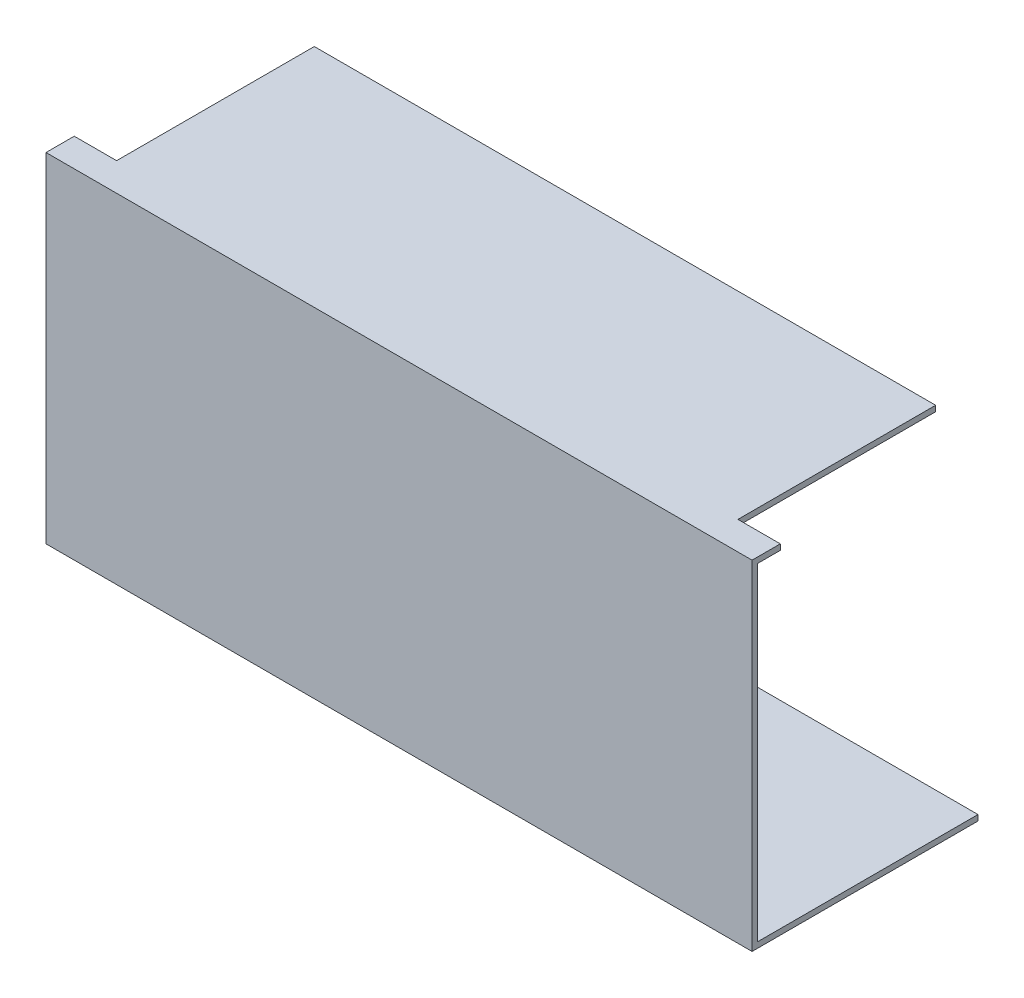
ISO-10303-21;
HEADER;
FILE_DESCRIPTION(('STEP AP214'),'2;1');
FILE_NAME('part.step','',(''),(''),'','','');
FILE_SCHEMA(('AUTOMOTIVE_DESIGN { 1 0 10303 214 1 1 1 1 }'));
ENDSEC;
DATA;
#1=APPLICATION_CONTEXT('core data for automotive mechanical design processes');
#2=APPLICATION_PROTOCOL_DEFINITION('international standard','automotive_design',2000,#1);
#3=PRODUCT_CONTEXT('',#1,'mechanical');
#4=PRODUCT('Part','Part','',(#3));
#5=PRODUCT_RELATED_PRODUCT_CATEGORY('part','',(#4));
#6=PRODUCT_DEFINITION_FORMATION('','',#4);
#7=PRODUCT_DEFINITION_CONTEXT('part definition',#1,'design');
#8=PRODUCT_DEFINITION('design','',#6,#7);
#9=PRODUCT_DEFINITION_SHAPE('','',#8);
#10=(LENGTH_UNIT() NAMED_UNIT(*) SI_UNIT(.MILLI.,.METRE.));
#11=(NAMED_UNIT(*) PLANE_ANGLE_UNIT() SI_UNIT($,.RADIAN.));
#12=(NAMED_UNIT(*) SI_UNIT($,.STERADIAN.) SOLID_ANGLE_UNIT());
#13=UNCERTAINTY_MEASURE_WITH_UNIT(LENGTH_MEASURE(1.E-05),#10,'distance_accuracy_value','');
#14=(GEOMETRIC_REPRESENTATION_CONTEXT(3) GLOBAL_UNCERTAINTY_ASSIGNED_CONTEXT((#13)) GLOBAL_UNIT_ASSIGNED_CONTEXT((#10,
#11,#12)) REPRESENTATION_CONTEXT('',''));
#15=CARTESIAN_POINT('',(0.,0.,0.));
#16=DIRECTION('',(0.,0.,1.));
#17=DIRECTION('',(1.,0.,0.));
#18=AXIS2_PLACEMENT_3D('',#15,#16,#17);
#19=CARTESIAN_POINT('',(0.625,-0.3,1.));
#20=DIRECTION('',(0.,1.,0.));
#21=DIRECTION('',(0.,0.,1.));
#22=AXIS2_PLACEMENT_3D('',#19,#20,#21);
#23=PLANE('',#22);
#24=DIRECTION('',(0.,0.,-1.));
#25=VECTOR('',#24,1.);
#26=CARTESIAN_POINT('',(-0.625,-0.3,0.799999999813736));
#27=LINE('',#26,#25);
#28=CARTESIAN_POINT('',(-0.625,-0.299999999627471,1.));
#29=VERTEX_POINT('',#28);
#30=CARTESIAN_POINT('',(-0.625,-0.3,0.599999999627471));
#31=VERTEX_POINT('',#30);
#32=EDGE_CURVE('E11',#29,#31,#27,.T.);
#33=ORIENTED_EDGE('',*,*,#32,.T.);
#34=DIRECTION('',(-1.,0.,0.));
#35=VECTOR('',#34,1.);
#36=CARTESIAN_POINT('',(0.,-0.3,0.599999999627471));
#37=LINE('',#36,#35);
#38=CARTESIAN_POINT('',(0.625,-0.3,0.599999999627471));
#39=VERTEX_POINT('',#38);
#40=EDGE_CURVE('E24',#39,#31,#37,.T.);
#41=ORIENTED_EDGE('',*,*,#40,.F.);
#42=DIRECTION('',(0.,0.,-1.));
#43=VECTOR('',#42,1.);
#44=CARTESIAN_POINT('',(0.625,-0.3,0.799999999813736));
#45=LINE('',#44,#43);
#46=CARTESIAN_POINT('',(0.625,-0.299999999627471,1.));
#47=VERTEX_POINT('',#46);
#48=EDGE_CURVE('E199',#47,#39,#45,.T.);
#49=ORIENTED_EDGE('',*,*,#48,.F.);
#50=DIRECTION('',(-1.,0.,0.));
#51=VECTOR('',#50,1.);
#52=CARTESIAN_POINT('',(0.,-0.299999999627471,1.));
#53=LINE('',#52,#51);
#54=EDGE_CURVE('E197',#47,#29,#53,.T.);
#55=ORIENTED_EDGE('',*,*,#54,.T.);
#56=EDGE_LOOP('',(#33,#41,#49,#55));
#57=FACE_BOUND('',#56,.T.);
#58=ADVANCED_FACE('F17',(#57),#23,.F.);
#59=CARTESIAN_POINT('',(0.625,-0.29,0.6));
#60=DIRECTION('',(0.,0.,1.));
#61=DIRECTION('',(1.,0.,0.));
#62=AXIS2_PLACEMENT_3D('',#59,#60,#61);
#63=PLANE('',#62);
#64=DIRECTION('',(0.,1.,0.));
#65=VECTOR('',#64,1.);
#66=CARTESIAN_POINT('',(-0.625,-0.294999999888241,0.6));
#67=LINE('',#66,#65);
#68=CARTESIAN_POINT('',(-0.625,-0.29,0.6));
#69=VERTEX_POINT('',#68);
#70=EDGE_CURVE('E195',#31,#69,#67,.T.);
#71=ORIENTED_EDGE('',*,*,#70,.T.);
#72=DIRECTION('',(-1.,0.,0.));
#73=VECTOR('',#72,1.);
#74=CARTESIAN_POINT('',(0.,-0.29,0.6));
#75=LINE('',#74,#73);
#76=CARTESIAN_POINT('',(0.625,-0.29,0.6));
#77=VERTEX_POINT('',#76);
#78=EDGE_CURVE('E192',#77,#69,#75,.T.);
#79=ORIENTED_EDGE('',*,*,#78,.F.);
#80=DIRECTION('',(0.,1.,0.));
#81=VECTOR('',#80,1.);
#82=CARTESIAN_POINT('',(0.625,-0.294999999888241,0.6));
#83=LINE('',#82,#81);
#84=EDGE_CURVE('E189',#39,#77,#83,.T.);
#85=ORIENTED_EDGE('',*,*,#84,.F.);
#86=ORIENTED_EDGE('',*,*,#40,.T.);
#87=EDGE_LOOP('',(#71,#79,#85,#86));
#88=FACE_BOUND('',#87,.T.);
#89=ADVANCED_FACE('F203',(#88),#63,.F.);
#90=CARTESIAN_POINT('',(0.625,-0.29,0.99));
#91=DIRECTION('',(0.,-1.,0.));
#92=DIRECTION('',(0.,0.,-1.));
#93=AXIS2_PLACEMENT_3D('',#90,#91,#92);
#94=PLANE('',#93);
#95=DIRECTION('',(0.,0.,1.));
#96=VECTOR('',#95,1.);
#97=CARTESIAN_POINT('',(-0.625,-0.29,0.794999999701977));
#98=LINE('',#97,#96);
#99=CARTESIAN_POINT('',(-0.625,-0.29,0.99));
#100=VERTEX_POINT('',#99);
#101=EDGE_CURVE('E187',#69,#100,#98,.T.);
#102=ORIENTED_EDGE('',*,*,#101,.T.);
#103=DIRECTION('',(-1.,0.,0.));
#104=VECTOR('',#103,1.);
#105=CARTESIAN_POINT('',(0.,-0.29,0.99));
#106=LINE('',#105,#104);
#107=CARTESIAN_POINT('',(0.625,-0.29,0.99));
#108=VERTEX_POINT('',#107);
#109=EDGE_CURVE('E184',#108,#100,#106,.T.);
#110=ORIENTED_EDGE('',*,*,#109,.F.);
#111=DIRECTION('',(0.,0.,1.));
#112=VECTOR('',#111,1.);
#113=CARTESIAN_POINT('',(0.625,-0.29,0.794999999701977));
#114=LINE('',#113,#112);
#115=EDGE_CURVE('E181',#77,#108,#114,.T.);
#116=ORIENTED_EDGE('',*,*,#115,.F.);
#117=ORIENTED_EDGE('',*,*,#78,.T.);
#118=EDGE_LOOP('',(#102,#110,#116,#117));
#119=FACE_BOUND('',#118,.T.);
#120=ADVANCED_FACE('F209',(#119),#94,.F.);
#121=CARTESIAN_POINT('',(0.625,0.29,0.99));
#122=DIRECTION('',(0.,0.,1.));
#123=DIRECTION('',(1.,0.,0.));
#124=AXIS2_PLACEMENT_3D('',#121,#122,#123);
#125=PLANE('',#124);
#126=DIRECTION('',(0.,1.,0.));
#127=VECTOR('',#126,1.);
#128=CARTESIAN_POINT('',(-0.625,-3.72531450132385E-11,0.99));
#129=LINE('',#128,#127);
#130=CARTESIAN_POINT('',(-0.625,0.29,0.99));
#131=VERTEX_POINT('',#130);
#132=EDGE_CURVE('E179',#100,#131,#129,.T.);
#133=ORIENTED_EDGE('',*,*,#132,.T.);
#134=DIRECTION('',(-1.,0.,0.));
#135=VECTOR('',#134,1.);
#136=CARTESIAN_POINT('',(0.,0.29,0.99));
#137=LINE('',#136,#135);
#138=CARTESIAN_POINT('',(0.625,0.29,0.99));
#139=VERTEX_POINT('',#138);
#140=EDGE_CURVE('E176',#139,#131,#137,.T.);
#141=ORIENTED_EDGE('',*,*,#140,.F.);
#142=DIRECTION('',(0.,1.,0.));
#143=VECTOR('',#142,1.);
#144=CARTESIAN_POINT('',(0.625,-3.72531450132385E-11,0.99));
#145=LINE('',#144,#143);
#146=EDGE_CURVE('E173',#108,#139,#145,.T.);
#147=ORIENTED_EDGE('',*,*,#146,.F.);
#148=ORIENTED_EDGE('',*,*,#109,.T.);
#149=EDGE_LOOP('',(#133,#141,#147,#148));
#150=FACE_BOUND('',#149,.T.);
#151=ADVANCED_FACE('F213',(#150),#125,.F.);
#152=CARTESIAN_POINT('',(0.625,0.29,0.6));
#153=DIRECTION('',(0.,1.,0.));
#154=DIRECTION('',(0.,0.,1.));
#155=AXIS2_PLACEMENT_3D('',#152,#153,#154);
#156=PLANE('',#155);
#157=DIRECTION('',(-1.,0.,0.));
#158=VECTOR('',#157,1.);
#159=CARTESIAN_POINT('',(0.,0.29,0.6));
#160=LINE('',#159,#158);
#161=CARTESIAN_POINT('',(0.550000000745058,0.29,0.6));
#162=VERTEX_POINT('',#161);
#163=CARTESIAN_POINT('',(-0.550000000745058,0.29,0.6));
#164=VERTEX_POINT('',#163);
#165=EDGE_CURVE('E171',#162,#164,#160,.T.);
#166=ORIENTED_EDGE('',*,*,#165,.F.);
#167=DIRECTION('',(0.,0.,1.));
#168=VECTOR('',#167,1.);
#169=CARTESIAN_POINT('',(0.550000000745058,0.29,0.774999999813736));
#170=LINE('',#169,#168);
#171=CARTESIAN_POINT('',(0.550000000745058,0.29,0.949999999627471));
#172=VERTEX_POINT('',#171);
#173=EDGE_CURVE('E169',#162,#172,#170,.T.);
#174=ORIENTED_EDGE('',*,*,#173,.T.);
#175=DIRECTION('',(1.,0.,0.));
#176=VECTOR('',#175,1.);
#177=CARTESIAN_POINT('',(0.587500000372529,0.29,0.949999999627471));
#178=LINE('',#177,#176);
#179=CARTESIAN_POINT('',(0.625,0.29,0.949999999627471));
#180=VERTEX_POINT('',#179);
#181=EDGE_CURVE('E119',#172,#180,#178,.T.);
#182=ORIENTED_EDGE('',*,*,#181,.T.);
#183=DIRECTION('',(0.,0.,-1.));
#184=VECTOR('',#183,1.);
#185=CARTESIAN_POINT('',(0.625,0.29,0.970000000111759));
#186=LINE('',#185,#184);
#187=EDGE_CURVE('E165',#139,#180,#186,.T.);
#188=ORIENTED_EDGE('',*,*,#187,.F.);
#189=ORIENTED_EDGE('',*,*,#140,.T.);
#190=DIRECTION('',(0.,0.,-1.));
#191=VECTOR('',#190,1.);
#192=CARTESIAN_POINT('',(-0.625,0.29,0.970000000111759));
#193=LINE('',#192,#191);
#194=CARTESIAN_POINT('',(-0.625,0.29,0.949999999627471));
#195=VERTEX_POINT('',#194);
#196=EDGE_CURVE('E163',#131,#195,#193,.T.);
#197=ORIENTED_EDGE('',*,*,#196,.T.);
#198=DIRECTION('',(1.,0.,0.));
#199=VECTOR('',#198,1.);
#200=CARTESIAN_POINT('',(-0.587500000372529,0.29,0.949999999627471));
#201=LINE('',#200,#199);
#202=CARTESIAN_POINT('',(-0.550000000745058,0.29,0.949999999627471));
#203=VERTEX_POINT('',#202);
#204=EDGE_CURVE('E161',#195,#203,#201,.T.);
#205=ORIENTED_EDGE('',*,*,#204,.T.);
#206=DIRECTION('',(0.,0.,-1.));
#207=VECTOR('',#206,1.);
#208=CARTESIAN_POINT('',(-0.550000000745058,0.29,0.774999999813736));
#209=LINE('',#208,#207);
#210=EDGE_CURVE('E158',#203,#164,#209,.T.);
#211=ORIENTED_EDGE('',*,*,#210,.T.);
#212=EDGE_LOOP('',(#166,#174,#182,#188,#189,#197,#205,#211));
#213=FACE_BOUND('',#212,.T.);
#214=ADVANCED_FACE('F218',(#213),#156,.F.);
#215=CARTESIAN_POINT('',(0.625,0.3,1.));
#216=DIRECTION('',(1.,0.,0.));
#217=DIRECTION('',(0.,0.,-1.));
#218=AXIS2_PLACEMENT_3D('',#215,#216,#217);
#219=PLANE('',#218);
#220=DIRECTION('',(0.,1.,0.));
#221=VECTOR('',#220,1.);
#222=CARTESIAN_POINT('',(0.625,0.295000000111758,0.949999999254942));
#223=LINE('',#222,#221);
#224=CARTESIAN_POINT('',(0.625,0.3,0.949999999627471));
#225=VERTEX_POINT('',#224);
#226=EDGE_CURVE('E156',#180,#225,#223,.T.);
#227=ORIENTED_EDGE('',*,*,#226,.T.);
#228=DIRECTION('',(0.,0.,1.));
#229=VECTOR('',#228,1.);
#230=CARTESIAN_POINT('',(0.625,0.3,0.975));
#231=LINE('',#230,#229);
#232=CARTESIAN_POINT('',(0.625,0.3,1.00000000037253));
#233=VERTEX_POINT('',#232);
#234=EDGE_CURVE('E124',#225,#233,#231,.T.);
#235=ORIENTED_EDGE('',*,*,#234,.T.);
#236=DIRECTION('',(0.,-1.,0.));
#237=VECTOR('',#236,1.);
#238=CARTESIAN_POINT('',(0.625,1.86264448309714E-10,1.));
#239=LINE('',#238,#237);
#240=EDGE_CURVE('E152',#233,#47,#239,.T.);
#241=ORIENTED_EDGE('',*,*,#240,.T.);
#242=ORIENTED_EDGE('',*,*,#48,.T.);
#243=ORIENTED_EDGE('',*,*,#84,.T.);
#244=ORIENTED_EDGE('',*,*,#115,.T.);
#245=ORIENTED_EDGE('',*,*,#146,.T.);
#246=ORIENTED_EDGE('',*,*,#187,.T.);
#247=EDGE_LOOP('',(#227,#235,#241,#242,#243,#244,#245,#246));
#248=FACE_BOUND('',#247,.T.);
#249=ADVANCED_FACE('F216',(#248),#219,.T.);
#250=CARTESIAN_POINT('',(0.625,0.3,1.));
#251=DIRECTION('',(0.,0.,-1.));
#252=DIRECTION('',(-1.,0.,0.));
#253=AXIS2_PLACEMENT_3D('',#250,#251,#252);
#254=PLANE('',#253);
#255=DIRECTION('',(0.,-1.,0.));
#256=VECTOR('',#255,1.);
#257=CARTESIAN_POINT('',(-0.625,1.86264448309714E-10,1.));
#258=LINE('',#257,#256);
#259=CARTESIAN_POINT('',(-0.625,0.3,1.00000000037253));
#260=VERTEX_POINT('',#259);
#261=EDGE_CURVE('E149',#260,#29,#258,.T.);
#262=ORIENTED_EDGE('',*,*,#261,.T.);
#263=ORIENTED_EDGE('',*,*,#54,.F.);
#264=ORIENTED_EDGE('',*,*,#240,.F.);
#265=DIRECTION('',(-1.,0.,0.));
#266=VECTOR('',#265,1.);
#267=CARTESIAN_POINT('',(0.,0.3,1.00000000037253));
#268=LINE('',#267,#266);
#269=EDGE_CURVE('E146',#233,#260,#268,.T.);
#270=ORIENTED_EDGE('',*,*,#269,.T.);
#271=EDGE_LOOP('',(#262,#263,#264,#270));
#272=FACE_BOUND('',#271,.T.);
#273=ADVANCED_FACE('F234',(#272),#254,.F.);
#274=CARTESIAN_POINT('',(-0.625,0.3,1.));
#275=DIRECTION('',(1.,0.,0.));
#276=DIRECTION('',(0.,0.,-1.));
#277=AXIS2_PLACEMENT_3D('',#274,#275,#276);
#278=PLANE('',#277);
#279=DIRECTION('',(0.,0.,1.));
#280=VECTOR('',#279,1.);
#281=CARTESIAN_POINT('',(-0.625,0.3,0.975));
#282=LINE('',#281,#280);
#283=CARTESIAN_POINT('',(-0.625,0.3,0.949999999627471));
#284=VERTEX_POINT('',#283);
#285=EDGE_CURVE('E143',#284,#260,#282,.T.);
#286=ORIENTED_EDGE('',*,*,#285,.F.);
#287=DIRECTION('',(0.,1.,0.));
#288=VECTOR('',#287,1.);
#289=CARTESIAN_POINT('',(-0.625,0.295000000111758,0.949999999254942));
#290=LINE('',#289,#288);
#291=EDGE_CURVE('E140',#195,#284,#290,.T.);
#292=ORIENTED_EDGE('',*,*,#291,.F.);
#293=ORIENTED_EDGE('',*,*,#196,.F.);
#294=ORIENTED_EDGE('',*,*,#132,.F.);
#295=ORIENTED_EDGE('',*,*,#101,.F.);
#296=ORIENTED_EDGE('',*,*,#70,.F.);
#297=ORIENTED_EDGE('',*,*,#32,.F.);
#298=ORIENTED_EDGE('',*,*,#261,.F.);
#299=EDGE_LOOP('',(#286,#292,#293,#294,#295,#296,#297,#298));
#300=FACE_BOUND('',#299,.T.);
#301=ADVANCED_FACE('F205',(#300),#278,.F.);
#302=CARTESIAN_POINT('',(-0.625,-0.0679455265819091,0.95));
#303=DIRECTION('',(0.,0.,1.));
#304=DIRECTION('',(0.,-1.,0.));
#305=AXIS2_PLACEMENT_3D('',#302,#303,#304);
#306=PLANE('',#305);
#307=ORIENTED_EDGE('',*,*,#291,.T.);
#308=DIRECTION('',(1.,0.,0.));
#309=VECTOR('',#308,1.);
#310=CARTESIAN_POINT('',(-0.587500000372529,0.3,0.949999999627471));
#311=LINE('',#310,#309);
#312=CARTESIAN_POINT('',(-0.550000000745058,0.3,0.949999999627471));
#313=VERTEX_POINT('',#312);
#314=EDGE_CURVE('E138',#284,#313,#311,.T.);
#315=ORIENTED_EDGE('',*,*,#314,.T.);
#316=DIRECTION('',(0.,1.,0.));
#317=VECTOR('',#316,1.);
#318=CARTESIAN_POINT('',(-0.550000000745058,0.294999999325071,0.95));
#319=LINE('',#318,#317);
#320=EDGE_CURVE('E135',#203,#313,#319,.T.);
#321=ORIENTED_EDGE('',*,*,#320,.F.);
#322=ORIENTED_EDGE('',*,*,#204,.F.);
#323=EDGE_LOOP('',(#307,#315,#321,#322));
#324=FACE_BOUND('',#323,.T.);
#325=ADVANCED_FACE('F230',(#324),#306,.F.);
#326=CARTESIAN_POINT('',(-0.55,-0.0679455265819091,0.95));
#327=DIRECTION('',(1.,0.,0.));
#328=DIRECTION('',(0.,0.,-1.));
#329=AXIS2_PLACEMENT_3D('',#326,#327,#328);
#330=PLANE('',#329);
#331=ORIENTED_EDGE('',*,*,#320,.T.);
#332=DIRECTION('',(0.,0.,-1.));
#333=VECTOR('',#332,1.);
#334=CARTESIAN_POINT('',(-0.550000000745058,0.3,0.774999999813736));
#335=LINE('',#334,#333);
#336=CARTESIAN_POINT('',(-0.550000000745058,0.3,0.6));
#337=VERTEX_POINT('',#336);
#338=EDGE_CURVE('E133',#313,#337,#335,.T.);
#339=ORIENTED_EDGE('',*,*,#338,.T.);
#340=DIRECTION('',(0.,1.,0.));
#341=VECTOR('',#340,1.);
#342=CARTESIAN_POINT('',(-0.550000000745058,0.295000000111758,0.6));
#343=LINE('',#342,#341);
#344=EDGE_CURVE('E130',#164,#337,#343,.T.);
#345=ORIENTED_EDGE('',*,*,#344,.F.);
#346=ORIENTED_EDGE('',*,*,#210,.F.);
#347=EDGE_LOOP('',(#331,#339,#345,#346));
#348=FACE_BOUND('',#347,.T.);
#349=ADVANCED_FACE('F225',(#348),#330,.F.);
#350=CARTESIAN_POINT('',(0.625,0.3,0.6));
#351=DIRECTION('',(0.,0.,1.));
#352=DIRECTION('',(1.,0.,0.));
#353=AXIS2_PLACEMENT_3D('',#350,#351,#352);
#354=PLANE('',#353);
#355=DIRECTION('',(-1.,0.,0.));
#356=VECTOR('',#355,1.);
#357=CARTESIAN_POINT('',(0.,0.3,0.6));
#358=LINE('',#357,#356);
#359=CARTESIAN_POINT('',(0.550000000745058,0.3,0.6));
#360=VERTEX_POINT('',#359);
#361=EDGE_CURVE('E128',#360,#337,#358,.T.);
#362=ORIENTED_EDGE('',*,*,#361,.F.);
#363=DIRECTION('',(0.,1.,0.));
#364=VECTOR('',#363,1.);
#365=CARTESIAN_POINT('',(0.550000000745058,0.295000000111758,0.6));
#366=LINE('',#365,#364);
#367=EDGE_CURVE('E108',#162,#360,#366,.T.);
#368=ORIENTED_EDGE('',*,*,#367,.F.);
#369=ORIENTED_EDGE('',*,*,#165,.T.);
#370=ORIENTED_EDGE('',*,*,#344,.T.);
#371=EDGE_LOOP('',(#362,#368,#369,#370));
#372=FACE_BOUND('',#371,.T.);
#373=ADVANCED_FACE('F220',(#372),#354,.F.);
#374=CARTESIAN_POINT('',(0.55,-0.0679455265819091,0.95));
#375=DIRECTION('',(-1.,0.,0.));
#376=DIRECTION('',(0.,0.,1.));
#377=AXIS2_PLACEMENT_3D('',#374,#375,#376);
#378=PLANE('',#377);
#379=ORIENTED_EDGE('',*,*,#367,.T.);
#380=DIRECTION('',(0.,0.,1.));
#381=VECTOR('',#380,1.);
#382=CARTESIAN_POINT('',(0.550000000745058,0.3,0.774999999813736));
#383=LINE('',#382,#381);
#384=CARTESIAN_POINT('',(0.550000000745058,0.3,0.949999999627471));
#385=VERTEX_POINT('',#384);
#386=EDGE_CURVE('E102',#360,#385,#383,.T.);
#387=ORIENTED_EDGE('',*,*,#386,.T.);
#388=DIRECTION('',(0.,1.,0.));
#389=VECTOR('',#388,1.);
#390=CARTESIAN_POINT('',(0.55,0.294999999325071,0.95));
#391=LINE('',#390,#389);
#392=EDGE_CURVE('E106',#172,#385,#391,.T.);
#393=ORIENTED_EDGE('',*,*,#392,.F.);
#394=ORIENTED_EDGE('',*,*,#173,.F.);
#395=EDGE_LOOP('',(#379,#387,#393,#394));
#396=FACE_BOUND('',#395,.T.);
#397=ADVANCED_FACE('F104',(#396),#378,.F.);
#398=CARTESIAN_POINT('',(0.625,-0.0679455265819091,0.95));
#399=DIRECTION('',(0.,0.,1.));
#400=DIRECTION('',(0.,-1.,0.));
#401=AXIS2_PLACEMENT_3D('',#398,#399,#400);
#402=PLANE('',#401);
#403=ORIENTED_EDGE('',*,*,#392,.T.);
#404=DIRECTION('',(1.,0.,0.));
#405=VECTOR('',#404,1.);
#406=CARTESIAN_POINT('',(0.587500000372529,0.3,0.949999999627471));
#407=LINE('',#406,#405);
#408=EDGE_CURVE('E118',#385,#225,#407,.T.);
#409=ORIENTED_EDGE('',*,*,#408,.T.);
#410=ORIENTED_EDGE('',*,*,#226,.F.);
#411=ORIENTED_EDGE('',*,*,#181,.F.);
#412=EDGE_LOOP('',(#403,#409,#410,#411));
#413=FACE_BOUND('',#412,.T.);
#414=ADVANCED_FACE('F116',(#413),#402,.F.);
#415=CARTESIAN_POINT('',(0.625,0.3,0.6));
#416=DIRECTION('',(0.,-1.,0.));
#417=DIRECTION('',(0.,0.,-1.));
#418=AXIS2_PLACEMENT_3D('',#415,#416,#417);
#419=PLANE('',#418);
#420=ORIENTED_EDGE('',*,*,#408,.F.);
#421=ORIENTED_EDGE('',*,*,#386,.F.);
#422=ORIENTED_EDGE('',*,*,#361,.T.);
#423=ORIENTED_EDGE('',*,*,#338,.F.);
#424=ORIENTED_EDGE('',*,*,#314,.F.);
#425=ORIENTED_EDGE('',*,*,#285,.T.);
#426=ORIENTED_EDGE('',*,*,#269,.F.);
#427=ORIENTED_EDGE('',*,*,#234,.F.);
#428=EDGE_LOOP('',(#420,#421,#422,#423,#424,#425,#426,#427));
#429=FACE_BOUND('',#428,.T.);
#430=ADVANCED_FACE('F122',(#429),#419,.F.);
#431=CLOSED_SHELL('',(#58,#89,#120,#151,#214,#249,#273,#301,#325,#349,#373,#397,#414,#430));
#432=MANIFOLD_SOLID_BREP('B1',#431);
#433=ADVANCED_BREP_SHAPE_REPRESENTATION('',(#18,#432),#14);
#434=SHAPE_DEFINITION_REPRESENTATION(#9,#433);
ENDSEC;
END-ISO-10303-21;
